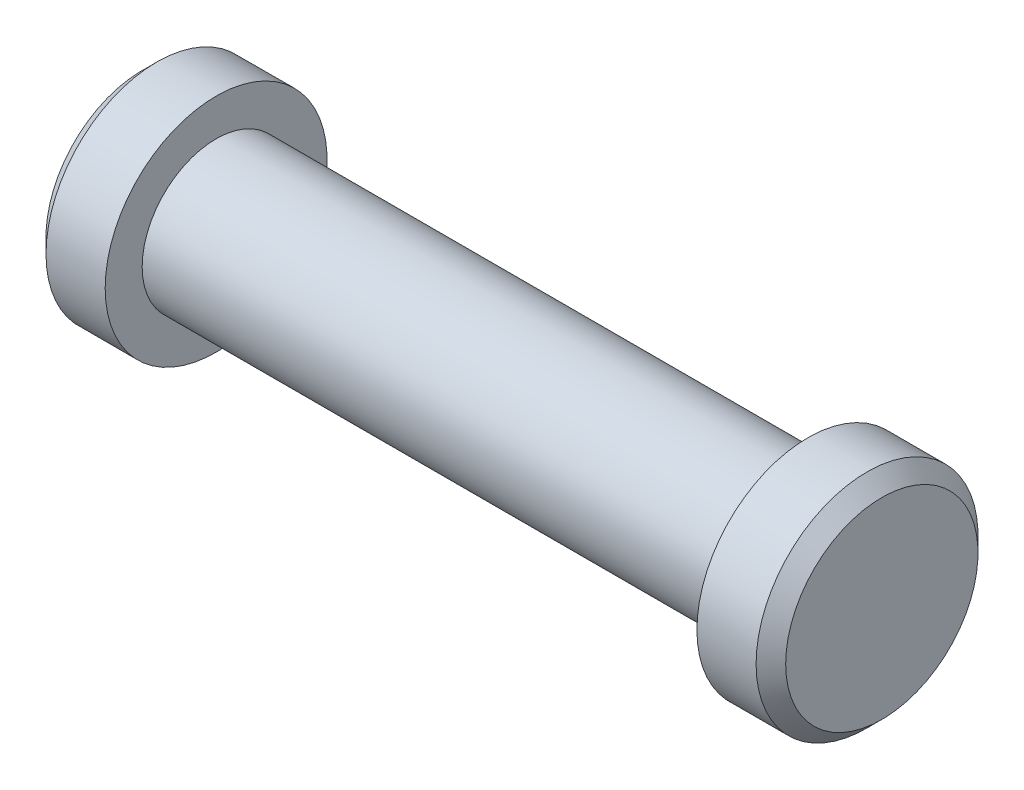
ISO-10303-21;
HEADER;
FILE_DESCRIPTION(('STEP AP214'),'2;1');
FILE_NAME('part.step','',(''),(''),'','','');
FILE_SCHEMA(('AUTOMOTIVE_DESIGN { 1 0 10303 214 1 1 1 1 }'));
ENDSEC;
DATA;
#1=APPLICATION_CONTEXT('core data for automotive mechanical design processes');
#2=APPLICATION_PROTOCOL_DEFINITION('international standard','automotive_design',2000,#1);
#3=PRODUCT_CONTEXT('',#1,'mechanical');
#4=PRODUCT('Part','Part','',(#3));
#5=PRODUCT_RELATED_PRODUCT_CATEGORY('part','',(#4));
#6=PRODUCT_DEFINITION_FORMATION('','',#4);
#7=PRODUCT_DEFINITION_CONTEXT('part definition',#1,'design');
#8=PRODUCT_DEFINITION('design','',#6,#7);
#9=PRODUCT_DEFINITION_SHAPE('','',#8);
#10=(LENGTH_UNIT() NAMED_UNIT(*) SI_UNIT(.MILLI.,.METRE.));
#11=(NAMED_UNIT(*) PLANE_ANGLE_UNIT() SI_UNIT($,.RADIAN.));
#12=(NAMED_UNIT(*) SI_UNIT($,.STERADIAN.) SOLID_ANGLE_UNIT());
#13=UNCERTAINTY_MEASURE_WITH_UNIT(LENGTH_MEASURE(1.E-05),#10,'distance_accuracy_value','');
#14=(GEOMETRIC_REPRESENTATION_CONTEXT(3) GLOBAL_UNCERTAINTY_ASSIGNED_CONTEXT((#13)) GLOBAL_UNIT_ASSIGNED_CONTEXT((#10,
#11,#12)) REPRESENTATION_CONTEXT('',''));
#15=CARTESIAN_POINT('',(0.,0.,0.));
#16=DIRECTION('',(0.,0.,1.));
#17=DIRECTION('',(1.,0.,0.));
#18=AXIS2_PLACEMENT_3D('',#15,#16,#17);
#19=CARTESIAN_POINT('',(-9.525,0.,0.));
#20=DIRECTION('',(1.,0.,0.));
#21=DIRECTION('',(0.,0.,-1.));
#22=AXIS2_PLACEMENT_3D('',#19,#20,#21);
#23=PLANE('',#22);
#24=CARTESIAN_POINT('',(-9.525,0.,0.));
#25=DIRECTION('',(1.,0.,0.));
#26=DIRECTION('',(0.,0.,-1.));
#27=AXIS2_PLACEMENT_3D('',#24,#25,#26);
#28=CIRCLE('',#27,2.4765);
#29=CARTESIAN_POINT('',(-9.525,0.,-2.4765));
#30=VERTEX_POINT('',#29);
#31=EDGE_CURVE('E52',#30,#30,#28,.F.);
#32=ORIENTED_EDGE('',*,*,#31,.T.);
#33=EDGE_LOOP('',(#32));
#34=FACE_BOUND('',#33,.T.);
#35=ADVANCED_FACE('F37',(#34),#23,.F.);
#36=CARTESIAN_POINT('',(-9.525,0.,0.));
#37=DIRECTION('',(-1.,0.,0.));
#38=DIRECTION('',(0.,0.,1.));
#39=AXIS2_PLACEMENT_3D('',#36,#37,#38);
#40=CYLINDRICAL_SURFACE('',#39,2.8575);
#41=CARTESIAN_POINT('',(-9.144,0.,0.));
#42=DIRECTION('',(1.,0.,0.));
#43=DIRECTION('',(0.,0.,-1.));
#44=AXIS2_PLACEMENT_3D('',#41,#42,#43);
#45=CIRCLE('',#44,2.8575);
#46=CARTESIAN_POINT('',(-9.144,0.,-2.8575));
#47=VERTEX_POINT('',#46);
#48=EDGE_CURVE('E48',#47,#47,#45,.T.);
#49=ORIENTED_EDGE('',*,*,#48,.T.);
#50=EDGE_LOOP('',(#49));
#51=FACE_BOUND('',#50,.T.);
#52=CARTESIAN_POINT('',(-7.62,0.,0.));
#53=DIRECTION('',(-1.,0.,0.));
#54=DIRECTION('',(0.,0.,1.));
#55=AXIS2_PLACEMENT_3D('',#52,#53,#54);
#56=CIRCLE('',#55,2.8575);
#57=CARTESIAN_POINT('',(-7.62,0.,2.8575));
#58=VERTEX_POINT('',#57);
#59=EDGE_CURVE('E57',#58,#58,#56,.T.);
#60=ORIENTED_EDGE('',*,*,#59,.T.);
#61=EDGE_LOOP('',(#60));
#62=FACE_BOUND('',#61,.T.);
#63=ADVANCED_FACE('F86',(#51,#62),#40,.T.);
#64=CARTESIAN_POINT('',(-7.62,2.8575,0.));
#65=DIRECTION('',(-1.,0.,0.));
#66=DIRECTION('',(0.,0.,1.));
#67=AXIS2_PLACEMENT_3D('',#64,#65,#66);
#68=PLANE('',#67);
#69=ORIENTED_EDGE('',*,*,#59,.F.);
#70=EDGE_LOOP('',(#69));
#71=FACE_BOUND('',#70,.T.);
#72=CARTESIAN_POINT('',(-7.62,0.,0.));
#73=DIRECTION('',(-1.,0.,0.));
#74=DIRECTION('',(0.,0.,1.));
#75=AXIS2_PLACEMENT_3D('',#72,#73,#74);
#76=CIRCLE('',#75,1.905);
#77=CARTESIAN_POINT('',(-7.62,0.,1.905));
#78=VERTEX_POINT('',#77);
#79=EDGE_CURVE('E60',#78,#78,#76,.T.);
#80=ORIENTED_EDGE('',*,*,#79,.T.);
#81=EDGE_LOOP('',(#80));
#82=FACE_BOUND('',#81,.T.);
#83=ADVANCED_FACE('F92',(#71,#82),#68,.F.);
#84=CARTESIAN_POINT('',(-9.525,0.,0.));
#85=DIRECTION('',(-1.,0.,0.));
#86=DIRECTION('',(0.,0.,1.));
#87=AXIS2_PLACEMENT_3D('',#84,#85,#86);
#88=CYLINDRICAL_SURFACE('',#87,1.905);
#89=ORIENTED_EDGE('',*,*,#79,.F.);
#90=EDGE_LOOP('',(#89));
#91=FACE_BOUND('',#90,.T.);
#92=CARTESIAN_POINT('',(7.62,0.,0.));
#93=DIRECTION('',(-1.,0.,0.));
#94=DIRECTION('',(0.,0.,1.));
#95=AXIS2_PLACEMENT_3D('',#92,#93,#94);
#96=CIRCLE('',#95,1.905);
#97=CARTESIAN_POINT('',(7.62,0.,1.905));
#98=VERTEX_POINT('',#97);
#99=EDGE_CURVE('E63',#98,#98,#96,.T.);
#100=ORIENTED_EDGE('',*,*,#99,.T.);
#101=EDGE_LOOP('',(#100));
#102=FACE_BOUND('',#101,.T.);
#103=ADVANCED_FACE('F82',(#91,#102),#88,.T.);
#104=CARTESIAN_POINT('',(7.62,1.905,0.));
#105=DIRECTION('',(1.,0.,0.));
#106=DIRECTION('',(0.,0.,-1.));
#107=AXIS2_PLACEMENT_3D('',#104,#105,#106);
#108=PLANE('',#107);
#109=ORIENTED_EDGE('',*,*,#99,.F.);
#110=EDGE_LOOP('',(#109));
#111=FACE_BOUND('',#110,.T.);
#112=CARTESIAN_POINT('',(7.62,0.,0.));
#113=DIRECTION('',(-1.,0.,0.));
#114=DIRECTION('',(0.,0.,1.));
#115=AXIS2_PLACEMENT_3D('',#112,#113,#114);
#116=CIRCLE('',#115,2.8575);
#117=CARTESIAN_POINT('',(7.62,0.,2.8575));
#118=VERTEX_POINT('',#117);
#119=EDGE_CURVE('E66',#118,#118,#116,.T.);
#120=ORIENTED_EDGE('',*,*,#119,.T.);
#121=EDGE_LOOP('',(#120));
#122=FACE_BOUND('',#121,.T.);
#123=ADVANCED_FACE('F70',(#111,#122),#108,.F.);
#124=CARTESIAN_POINT('',(-9.525,0.,0.));
#125=DIRECTION('',(-1.,0.,0.));
#126=DIRECTION('',(0.,0.,1.));
#127=AXIS2_PLACEMENT_3D('',#124,#125,#126);
#128=CYLINDRICAL_SURFACE('',#127,2.8575);
#129=CARTESIAN_POINT('',(9.144,0.,0.));
#130=DIRECTION('',(-1.,0.,0.));
#131=DIRECTION('',(0.,0.,1.));
#132=AXIS2_PLACEMENT_3D('',#129,#130,#131);
#133=CIRCLE('',#132,2.8575);
#134=CARTESIAN_POINT('',(9.144,0.,2.8575));
#135=VERTEX_POINT('',#134);
#136=EDGE_CURVE('E44',#135,#135,#133,.T.);
#137=ORIENTED_EDGE('',*,*,#136,.T.);
#138=EDGE_LOOP('',(#137));
#139=FACE_BOUND('',#138,.T.);
#140=ORIENTED_EDGE('',*,*,#119,.F.);
#141=EDGE_LOOP('',(#140));
#142=FACE_BOUND('',#141,.T.);
#143=ADVANCED_FACE('F72',(#139,#142),#128,.T.);
#144=CARTESIAN_POINT('',(9.525,2.8575,0.));
#145=DIRECTION('',(-1.,0.,0.));
#146=DIRECTION('',(0.,0.,1.));
#147=AXIS2_PLACEMENT_3D('',#144,#145,#146);
#148=PLANE('',#147);
#149=CARTESIAN_POINT('',(9.525,0.,0.));
#150=DIRECTION('',(-1.,0.,0.));
#151=DIRECTION('',(0.,0.,1.));
#152=AXIS2_PLACEMENT_3D('',#149,#150,#151);
#153=CIRCLE('',#152,2.4765);
#154=CARTESIAN_POINT('',(9.525,0.,2.4765));
#155=VERTEX_POINT('',#154);
#156=EDGE_CURVE('E10',#155,#155,#153,.F.);
#157=ORIENTED_EDGE('',*,*,#156,.T.);
#158=EDGE_LOOP('',(#157));
#159=FACE_BOUND('',#158,.T.);
#160=ADVANCED_FACE('F74',(#159),#148,.F.);
#161=CARTESIAN_POINT('',(-9.525,0.,0.));
#162=DIRECTION('',(1.,0.,0.));
#163=DIRECTION('',(0.,0.,-1.));
#164=AXIS2_PLACEMENT_3D('',#161,#162,#163);
#165=CONICAL_SURFACE('',#164,2.4765,0.785398163397446);
#166=ORIENTED_EDGE('',*,*,#48,.F.);
#167=EDGE_LOOP('',(#166));
#168=FACE_BOUND('',#167,.T.);
#169=ORIENTED_EDGE('',*,*,#31,.F.);
#170=EDGE_LOOP('',(#169));
#171=FACE_BOUND('',#170,.T.);
#172=ADVANCED_FACE('F80',(#168,#171),#165,.T.);
#173=CARTESIAN_POINT('',(9.144,0.,0.));
#174=DIRECTION('',(-1.,0.,0.));
#175=DIRECTION('',(0.,0.,1.));
#176=AXIS2_PLACEMENT_3D('',#173,#174,#175);
#177=CONICAL_SURFACE('',#176,2.8575,0.785398163397447);
#178=ORIENTED_EDGE('',*,*,#156,.F.);
#179=EDGE_LOOP('',(#178));
#180=FACE_BOUND('',#179,.T.);
#181=ORIENTED_EDGE('',*,*,#136,.F.);
#182=EDGE_LOOP('',(#181));
#183=FACE_BOUND('',#182,.T.);
#184=ADVANCED_FACE('F39',(#180,#183),#177,.T.);
#185=CLOSED_SHELL('',(#35,#63,#83,#103,#123,#143,#160,#172,#184));
#186=MANIFOLD_SOLID_BREP('B2',#185);
#187=ADVANCED_BREP_SHAPE_REPRESENTATION('',(#18,#186),#14);
#188=SHAPE_DEFINITION_REPRESENTATION(#9,#187);
ENDSEC;
END-ISO-10303-21;
